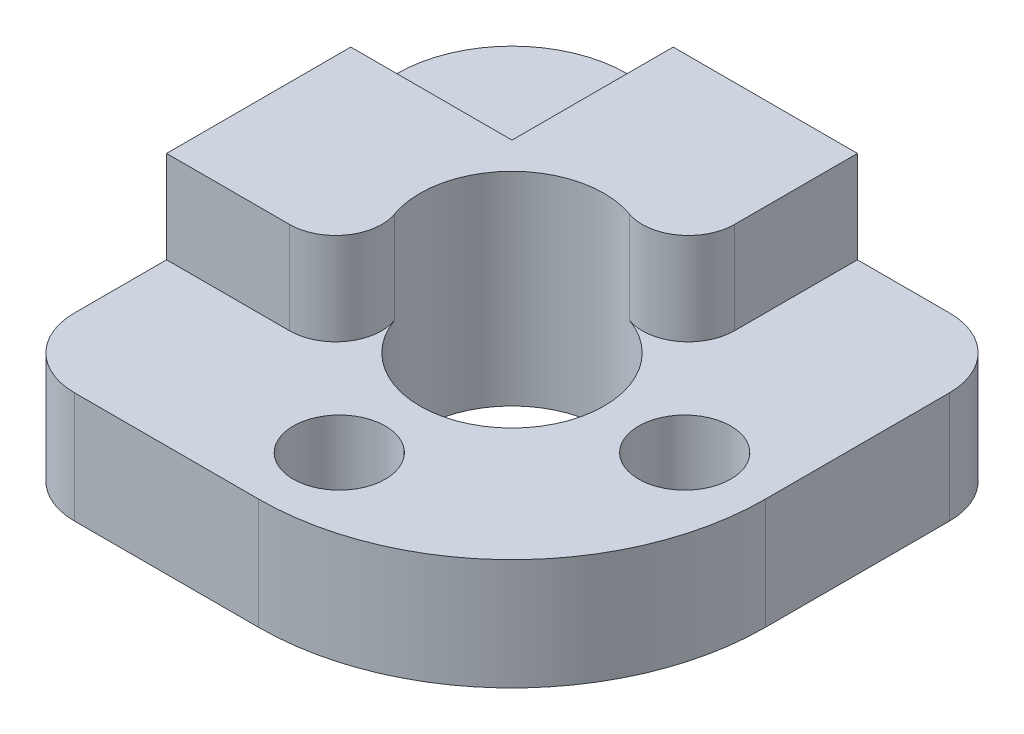
ISO-10303-21;
HEADER;
FILE_DESCRIPTION(('STEP AP214'),'2;1');
FILE_NAME('part.step','',(''),(''),'','','');
FILE_SCHEMA(('AUTOMOTIVE_DESIGN { 1 0 10303 214 1 1 1 1 }'));
ENDSEC;
DATA;
#1=APPLICATION_CONTEXT('core data for automotive mechanical design processes');
#2=APPLICATION_PROTOCOL_DEFINITION('international standard','automotive_design',2000,#1);
#3=PRODUCT_CONTEXT('',#1,'mechanical');
#4=PRODUCT('Part','Part','',(#3));
#5=PRODUCT_RELATED_PRODUCT_CATEGORY('part','',(#4));
#6=PRODUCT_DEFINITION_FORMATION('','',#4);
#7=PRODUCT_DEFINITION_CONTEXT('part definition',#1,'design');
#8=PRODUCT_DEFINITION('design','',#6,#7);
#9=PRODUCT_DEFINITION_SHAPE('','',#8);
#10=(LENGTH_UNIT() NAMED_UNIT(*) SI_UNIT(.MILLI.,.METRE.));
#11=(NAMED_UNIT(*) PLANE_ANGLE_UNIT() SI_UNIT($,.RADIAN.));
#12=(NAMED_UNIT(*) SI_UNIT($,.STERADIAN.) SOLID_ANGLE_UNIT());
#13=UNCERTAINTY_MEASURE_WITH_UNIT(LENGTH_MEASURE(1.E-05),#10,'distance_accuracy_value','');
#14=(GEOMETRIC_REPRESENTATION_CONTEXT(3) GLOBAL_UNCERTAINTY_ASSIGNED_CONTEXT((#13)) GLOBAL_UNIT_ASSIGNED_CONTEXT((#10,
#11,#12)) REPRESENTATION_CONTEXT('',''));
#15=CARTESIAN_POINT('',(0.,0.,0.));
#16=DIRECTION('',(0.,0.,1.));
#17=DIRECTION('',(1.,0.,0.));
#18=AXIS2_PLACEMENT_3D('',#15,#16,#17);
#19=CARTESIAN_POINT('',(635.26708984375,-230.9974182128,22.737565994263));
#20=DIRECTION('',(0.,-1.,0.));
#21=DIRECTION('',(1.,0.,0.));
#22=AXIS2_PLACEMENT_3D('',#19,#20,#21);
#23=CYLINDRICAL_SURFACE('',#22,2.);
#24=CARTESIAN_POINT('',(635.26708984376,-235.82241821281,22.737565994273));
#25=DIRECTION('',(0.,-1.,-5.00000234744697E-12));
#26=DIRECTION('',(1.,0.,0.));
#27=AXIS2_PLACEMENT_3D('',#24,#25,#26);
#28=CIRCLE('',#27,2.00000000001);
#29=CARTESIAN_POINT('',(637.26708984377,-235.82241821281,22.737565994273));
#30=VERTEX_POINT('',#29);
#31=EDGE_CURVE('E11',#30,#30,#28,.T.);
#32=ORIENTED_EDGE('',*,*,#31,.T.);
#33=EDGE_LOOP('',(#32));
#34=FACE_BOUND('',#33,.T.);
#35=CARTESIAN_POINT('',(635.26708984376,-230.99741821281,22.737565994273));
#36=DIRECTION('',(0.,-1.,-5.00000234744697E-12));
#37=DIRECTION('',(1.,0.,0.));
#38=AXIS2_PLACEMENT_3D('',#35,#36,#37);
#39=CIRCLE('',#38,2.00000000001);
#40=CARTESIAN_POINT('',(637.26708984377,-230.99741821281,22.737565994273));
#41=VERTEX_POINT('',#40);
#42=EDGE_CURVE('E271',#41,#41,#39,.T.);
#43=ORIENTED_EDGE('',*,*,#42,.F.);
#44=EDGE_LOOP('',(#43));
#45=FACE_BOUND('',#44,.T.);
#46=ADVANCED_FACE('F17',(#34,#45),#23,.F.);
#47=CARTESIAN_POINT('',(635.26708984375,-230.9974182128,15.237565994263));
#48=DIRECTION('',(0.,-1.,0.));
#49=DIRECTION('',(1.,0.,0.));
#50=AXIS2_PLACEMENT_3D('',#47,#48,#49);
#51=CYLINDRICAL_SURFACE('',#50,4.);
#52=CARTESIAN_POINT('',(635.26708984376,-235.82241821281,15.237565994273));
#53=DIRECTION('',(0.,-1.,-2.50000234746572E-12));
#54=DIRECTION('',(1.,0.,0.));
#55=AXIS2_PLACEMENT_3D('',#52,#53,#54);
#56=CIRCLE('',#55,4.00000000001001);
#57=CARTESIAN_POINT('',(639.26708984377,-235.82241821281,15.237565994273));
#58=VERTEX_POINT('',#57);
#59=EDGE_CURVE('E28',#58,#58,#56,.T.);
#60=ORIENTED_EDGE('',*,*,#59,.T.);
#61=EDGE_LOOP('',(#60));
#62=FACE_BOUND('',#61,.T.);
#63=CARTESIAN_POINT('',(635.26708984376,-226.99741821281,15.237565994273));
#64=DIRECTION('',(0.,-1.,-2.50000234746572E-12));
#65=DIRECTION('',(1.,0.,0.));
#66=AXIS2_PLACEMENT_3D('',#63,#64,#65);
#67=CIRCLE('',#66,4.00000000001001);
#68=CARTESIAN_POINT('',(631.495853677418,-226.9974182128,16.5708993275963));
#69=VERTEX_POINT('',#68);
#70=CARTESIAN_POINT('',(636.600423177082,-226.9974182128,11.4663298279341));
#71=VERTEX_POINT('',#70);
#72=EDGE_CURVE('E191',#69,#71,#67,.T.);
#73=ORIENTED_EDGE('',*,*,#72,.F.);
#74=DIRECTION('',(0.,1.,0.));
#75=VECTOR('',#74,1.);
#76=CARTESIAN_POINT('',(631.495853677432,-230.99741821281,16.5708993276055));
#77=LINE('',#76,#75);
#78=CARTESIAN_POINT('',(631.495853677418,-230.9974182128,16.5708993275963));
#79=VERTEX_POINT('',#78);
#80=EDGE_CURVE('E280',#79,#69,#77,.T.);
#81=ORIENTED_EDGE('',*,*,#80,.F.);
#82=CARTESIAN_POINT('',(635.26708984376,-230.99741821281,15.237565994273));
#83=DIRECTION('',(0.,-1.,-2.50000234746572E-12));
#84=DIRECTION('',(1.,0.,0.));
#85=AXIS2_PLACEMENT_3D('',#82,#83,#84);
#86=CIRCLE('',#85,4.00000000001001);
#87=CARTESIAN_POINT('',(636.600423177082,-230.9974182128,11.4663298279339));
#88=VERTEX_POINT('',#87);
#89=EDGE_CURVE('E21',#88,#79,#86,.T.);
#90=ORIENTED_EDGE('',*,*,#89,.F.);
#91=DIRECTION('',(0.,-1.,0.));
#92=VECTOR('',#91,1.);
#93=CARTESIAN_POINT('',(636.60042317709,-230.99741821281,11.4663298279436));
#94=LINE('',#93,#92);
#95=EDGE_CURVE('E43',#71,#88,#94,.T.);
#96=ORIENTED_EDGE('',*,*,#95,.F.);
#97=EDGE_LOOP('',(#73,#81,#90,#96));
#98=FACE_BOUND('',#97,.T.);
#99=ADVANCED_FACE('F1248',(#62,#98),#51,.F.);
#100=CARTESIAN_POINT('',(642.76708984375,-230.9974182128,15.237565994263));
#101=DIRECTION('',(0.,-1.,0.));
#102=DIRECTION('',(1.,0.,0.));
#103=AXIS2_PLACEMENT_3D('',#100,#101,#102);
#104=CYLINDRICAL_SURFACE('',#103,2.);
#105=CARTESIAN_POINT('',(642.76708984376,-235.82241821281,15.237565994273));
#106=DIRECTION('',(0.,-1.,-5.00000234744697E-12));
#107=DIRECTION('',(1.,0.,0.));
#108=AXIS2_PLACEMENT_3D('',#105,#106,#107);
#109=CIRCLE('',#108,2.00000000001);
#110=CARTESIAN_POINT('',(644.76708984377,-235.82241821281,15.237565994273));
#111=VERTEX_POINT('',#110);
#112=EDGE_CURVE('E229',#111,#111,#109,.T.);
#113=ORIENTED_EDGE('',*,*,#112,.T.);
#114=EDGE_LOOP('',(#113));
#115=FACE_BOUND('',#114,.T.);
#116=CARTESIAN_POINT('',(642.76708984376,-230.99741821281,15.237565994273));
#117=DIRECTION('',(0.,-1.,-5.00000234744697E-12));
#118=DIRECTION('',(1.,0.,0.));
#119=AXIS2_PLACEMENT_3D('',#116,#117,#118);
#120=CIRCLE('',#119,2.00000000001);
#121=CARTESIAN_POINT('',(644.76708984377,-230.99741821281,15.237565994273));
#122=VERTEX_POINT('',#121);
#123=EDGE_CURVE('E266',#122,#122,#120,.T.);
#124=ORIENTED_EDGE('',*,*,#123,.F.);
#125=EDGE_LOOP('',(#124));
#126=FACE_BOUND('',#125,.T.);
#127=ADVANCED_FACE('F1252',(#115,#126),#104,.F.);
#128=CARTESIAN_POINT('',(629.61023559425,-226.9974182128,17.237565994263));
#129=DIRECTION('',(0.,-1.,0.));
#130=DIRECTION('',(1.,0.,0.));
#131=AXIS2_PLACEMENT_3D('',#128,#129,#130);
#132=CYLINDRICAL_SURFACE('',#131,2.);
#133=CARTESIAN_POINT('',(629.61023559426,-226.99741821281,17.237565994273));
#134=DIRECTION('',(0.,-1.,-5.00000234744697E-12));
#135=DIRECTION('',(1.,0.,0.));
#136=AXIS2_PLACEMENT_3D('',#133,#134,#135);
#137=CIRCLE('',#136,2.00000000001);
#138=CARTESIAN_POINT('',(629.61023559425,-226.9974182128,19.237565994263));
#139=VERTEX_POINT('',#138);
#140=EDGE_CURVE('E206',#69,#139,#137,.T.);
#141=ORIENTED_EDGE('',*,*,#140,.T.);
#142=DIRECTION('',(0.,-1.,0.));
#143=VECTOR('',#142,1.);
#144=CARTESIAN_POINT('',(629.61023559426,-226.99741821281,19.237565994273));
#145=LINE('',#144,#143);
#146=CARTESIAN_POINT('',(629.61023559425,-230.9974182128,19.237565994263));
#147=VERTEX_POINT('',#146);
#148=EDGE_CURVE('E376',#139,#147,#145,.T.);
#149=ORIENTED_EDGE('',*,*,#148,.T.);
#150=CARTESIAN_POINT('',(629.61023559426,-230.99741821281,17.237565994273));
#151=DIRECTION('',(0.,-1.,-5.00000234744697E-12));
#152=DIRECTION('',(1.,0.,0.));
#153=AXIS2_PLACEMENT_3D('',#150,#151,#152);
#154=CIRCLE('',#153,2.00000000001);
#155=EDGE_CURVE('E317',#79,#147,#154,.T.);
#156=ORIENTED_EDGE('',*,*,#155,.F.);
#157=ORIENTED_EDGE('',*,*,#80,.T.);
#158=EDGE_LOOP('',(#141,#149,#156,#157));
#159=FACE_BOUND('',#158,.T.);
#160=ADVANCED_FACE('F1265',(#159),#132,.T.);
#161=CARTESIAN_POINT('',(635.26708984375,-235.8224182128,15.237565994263));
#162=DIRECTION('',(0.,1.,0.));
#163=DIRECTION('',(1.,0.,0.));
#164=AXIS2_PLACEMENT_3D('',#161,#162,#163);
#165=PLANE('',#164);
#166=DIRECTION('',(1.,0.,0.));
#167=VECTOR('',#166,1.);
#168=CARTESIAN_POINT('',(635.26708984376,-235.82241821281,26.237565994273));
#169=LINE('',#168,#167);
#170=CARTESIAN_POINT('',(627.26708984375,-235.8224182128,26.237565994263));
#171=VERTEX_POINT('',#170);
#172=CARTESIAN_POINT('',(635.26708984375,-235.8224182128,26.237565994263));
#173=VERTEX_POINT('',#172);
#174=EDGE_CURVE('E234',#171,#173,#169,.T.);
#175=ORIENTED_EDGE('',*,*,#174,.F.);
#176=CARTESIAN_POINT('',(627.26708984376,-235.82241821281,23.237565994273));
#177=DIRECTION('',(0.,1.,3.3333356807942E-12));
#178=DIRECTION('',(1.,0.,0.));
#179=AXIS2_PLACEMENT_3D('',#176,#177,#178);
#180=CIRCLE('',#179,3.00000000001);
#181=CARTESIAN_POINT('',(624.26708984375,-235.8224182128,23.237565994263));
#182=VERTEX_POINT('',#181);
#183=EDGE_CURVE('E257',#182,#171,#180,.T.);
#184=ORIENTED_EDGE('',*,*,#183,.F.);
#185=DIRECTION('',(0.,0.,1.));
#186=VECTOR('',#185,1.);
#187=CARTESIAN_POINT('',(624.26708984376,-235.82241821281,15.237565994273));
#188=LINE('',#187,#186);
#189=CARTESIAN_POINT('',(624.26708984375,-235.8224182128,9.237565994263));
#190=VERTEX_POINT('',#189);
#191=EDGE_CURVE('E258',#190,#182,#188,.T.);
#192=ORIENTED_EDGE('',*,*,#191,.F.);
#193=CARTESIAN_POINT('',(629.26708984376,-235.82241821281,9.237565994273));
#194=DIRECTION('',(0.,1.,2.00000234746798E-12));
#195=DIRECTION('',(1.,0.,0.));
#196=AXIS2_PLACEMENT_3D('',#193,#194,#195);
#197=CIRCLE('',#196,5.00000000001);
#198=CARTESIAN_POINT('',(629.267089843745,-235.8224182128,4.237565994263));
#199=VERTEX_POINT('',#198);
#200=EDGE_CURVE('E261',#199,#190,#197,.T.);
#201=ORIENTED_EDGE('',*,*,#200,.F.);
#202=DIRECTION('',(-1.,0.,0.));
#203=VECTOR('',#202,1.);
#204=CARTESIAN_POINT('',(635.26708984376,-235.82241821281,4.237565994273));
#205=LINE('',#204,#203);
#206=CARTESIAN_POINT('',(643.26708984375,-235.8224182128,4.237565994263));
#207=VERTEX_POINT('',#206);
#208=EDGE_CURVE('E279',#207,#199,#205,.T.);
#209=ORIENTED_EDGE('',*,*,#208,.F.);
#210=CARTESIAN_POINT('',(643.26708984376,-235.82241821281,7.237565994273));
#211=DIRECTION('',(0.,1.,3.3333356807942E-12));
#212=DIRECTION('',(1.,0.,0.));
#213=AXIS2_PLACEMENT_3D('',#210,#211,#212);
#214=CIRCLE('',#213,3.00000000001);
#215=CARTESIAN_POINT('',(646.26708984375,-235.8224182128,7.237565994263));
#216=VERTEX_POINT('',#215);
#217=EDGE_CURVE('E364',#216,#207,#214,.T.);
#218=ORIENTED_EDGE('',*,*,#217,.F.);
#219=DIRECTION('',(0.,0.,-1.));
#220=VECTOR('',#219,1.);
#221=CARTESIAN_POINT('',(646.26708984376,-235.82241821281,15.237565994273));
#222=LINE('',#221,#220);
#223=CARTESIAN_POINT('',(646.26708984375,-235.8224182128,15.237565994263));
#224=VERTEX_POINT('',#223);
#225=EDGE_CURVE('E304',#224,#216,#222,.T.);
#226=ORIENTED_EDGE('',*,*,#225,.F.);
#227=CARTESIAN_POINT('',(635.26708984376,-235.82241821281,15.237565994273));
#228=DIRECTION('',(-9.11614143236955E-13,1.,9.09093256562885E-13));
#229=DIRECTION('',(1.,9.11614143236955E-13,0.));
#230=AXIS2_PLACEMENT_3D('',#227,#228,#229);
#231=CIRCLE('',#230,11.00000000001);
#232=EDGE_CURVE('E233',#173,#224,#231,.T.);
#233=ORIENTED_EDGE('',*,*,#232,.F.);
#234=EDGE_LOOP('',(#175,#184,#192,#201,#209,#218,#226,#233));
#235=FACE_BOUND('',#234,.T.);
#236=ORIENTED_EDGE('',*,*,#31,.F.);
#237=EDGE_LOOP('',(#236));
#238=FACE_BOUND('',#237,.T.);
#239=ORIENTED_EDGE('',*,*,#59,.F.);
#240=EDGE_LOOP('',(#239));
#241=FACE_BOUND('',#240,.T.);
#242=ORIENTED_EDGE('',*,*,#112,.F.);
#243=EDGE_LOOP('',(#242));
#244=FACE_BOUND('',#243,.T.);
#245=ADVANCED_FACE('F417',(#235,#238,#241,#244),#165,.F.);
#246=CARTESIAN_POINT('',(635.26708984375,-230.9974182128,15.237565994263));
#247=DIRECTION('',(0.,-1.,0.));
#248=DIRECTION('',(1.,0.,0.));
#249=AXIS2_PLACEMENT_3D('',#246,#247,#248);
#250=CYLINDRICAL_SURFACE('',#249,11.);
#251=CARTESIAN_POINT('',(635.26708984376,-230.99741821281,15.237565994273));
#252=DIRECTION('',(9.11614143236955E-13,-1.,-9.09093256562885E-13));
#253=DIRECTION('',(1.,9.11614143236955E-13,0.));
#254=AXIS2_PLACEMENT_3D('',#251,#252,#253);
#255=CIRCLE('',#254,11.00000000001);
#256=CARTESIAN_POINT('',(646.26708984375,-230.9974182128,15.237565994263));
#257=VERTEX_POINT('',#256);
#258=CARTESIAN_POINT('',(635.26708984375,-230.9974182128,26.237565994263));
#259=VERTEX_POINT('',#258);
#260=EDGE_CURVE('E242',#257,#259,#255,.T.);
#261=ORIENTED_EDGE('',*,*,#260,.T.);
#262=DIRECTION('',(0.,-1.,0.));
#263=VECTOR('',#262,1.);
#264=CARTESIAN_POINT('',(635.26708984376,-230.99741821281,26.237565994273));
#265=LINE('',#264,#263);
#266=EDGE_CURVE('E238',#259,#173,#265,.T.);
#267=ORIENTED_EDGE('',*,*,#266,.T.);
#268=ORIENTED_EDGE('',*,*,#232,.T.);
#269=DIRECTION('',(0.,1.,0.));
#270=VECTOR('',#269,1.);
#271=CARTESIAN_POINT('',(646.26708984376,-230.99741821281,15.237565994273));
#272=LINE('',#271,#270);
#273=EDGE_CURVE('E230',#224,#257,#272,.T.);
#274=ORIENTED_EDGE('',*,*,#273,.T.);
#275=EDGE_LOOP('',(#261,#267,#268,#274));
#276=FACE_BOUND('',#275,.T.);
#277=ADVANCED_FACE('F1234',(#276),#250,.T.);
#278=CARTESIAN_POINT('',(635.26708984375,-230.9974182128,26.237565994263));
#279=DIRECTION('',(0.,0.,-1.));
#280=DIRECTION('',(-1.,0.,0.));
#281=AXIS2_PLACEMENT_3D('',#278,#279,#280);
#282=PLANE('',#281);
#283=ORIENTED_EDGE('',*,*,#266,.F.);
#284=DIRECTION('',(1.,0.,0.));
#285=VECTOR('',#284,1.);
#286=CARTESIAN_POINT('',(635.26708984376,-230.99741821281,26.237565994273));
#287=LINE('',#286,#285);
#288=CARTESIAN_POINT('',(627.26708984375,-230.9974182128,26.237565994263));
#289=VERTEX_POINT('',#288);
#290=EDGE_CURVE('E298',#289,#259,#287,.T.);
#291=ORIENTED_EDGE('',*,*,#290,.F.);
#292=DIRECTION('',(0.,1.,0.));
#293=VECTOR('',#292,1.);
#294=CARTESIAN_POINT('',(627.26708984376,-230.99741821281,26.237565994273));
#295=LINE('',#294,#293);
#296=EDGE_CURVE('E253',#171,#289,#295,.T.);
#297=ORIENTED_EDGE('',*,*,#296,.F.);
#298=ORIENTED_EDGE('',*,*,#174,.T.);
#299=EDGE_LOOP('',(#283,#291,#297,#298));
#300=FACE_BOUND('',#299,.T.);
#301=ADVANCED_FACE('F1183',(#300),#282,.F.);
#302=CARTESIAN_POINT('',(627.26708984375,-230.9974182128,23.237565994263));
#303=DIRECTION('',(0.,-1.,0.));
#304=DIRECTION('',(1.,0.,0.));
#305=AXIS2_PLACEMENT_3D('',#302,#303,#304);
#306=CYLINDRICAL_SURFACE('',#305,3.);
#307=CARTESIAN_POINT('',(627.26708984376,-230.99741821281,23.237565994273));
#308=DIRECTION('',(0.,-1.,-3.3333356807942E-12));
#309=DIRECTION('',(1.,0.,0.));
#310=AXIS2_PLACEMENT_3D('',#307,#308,#309);
#311=CIRCLE('',#310,3.00000000001);
#312=CARTESIAN_POINT('',(624.26708984375,-230.9974182128,23.237565994263));
#313=VERTEX_POINT('',#312);
#314=EDGE_CURVE('E243',#289,#313,#311,.T.);
#315=ORIENTED_EDGE('',*,*,#314,.T.);
#316=DIRECTION('',(0.,-1.,0.));
#317=VECTOR('',#316,1.);
#318=CARTESIAN_POINT('',(624.26708984376,-230.99741821281,23.237565994273));
#319=LINE('',#318,#317);
#320=EDGE_CURVE('E247',#313,#182,#319,.T.);
#321=ORIENTED_EDGE('',*,*,#320,.T.);
#322=ORIENTED_EDGE('',*,*,#183,.T.);
#323=ORIENTED_EDGE('',*,*,#296,.T.);
#324=EDGE_LOOP('',(#315,#321,#322,#323));
#325=FACE_BOUND('',#324,.T.);
#326=ADVANCED_FACE('F1175',(#325),#306,.T.);
#327=CARTESIAN_POINT('',(624.26708984375,-230.9974182128,9.237565994263));
#328=DIRECTION('',(1.,0.,0.));
#329=DIRECTION('',(0.,1.,0.));
#330=AXIS2_PLACEMENT_3D('',#327,#328,#329);
#331=PLANE('',#330);
#332=DIRECTION('',(0.,0.,1.));
#333=VECTOR('',#332,1.);
#334=CARTESIAN_POINT('',(624.26708984376,-230.99741821281,9.237565994273));
#335=LINE('',#334,#333);
#336=CARTESIAN_POINT('',(624.26708984375,-230.9974182128,19.237565994263));
#337=VERTEX_POINT('',#336);
#338=EDGE_CURVE('E293',#337,#313,#335,.T.);
#339=ORIENTED_EDGE('',*,*,#338,.F.);
#340=DIRECTION('',(0.,-1.,0.));
#341=VECTOR('',#340,1.);
#342=CARTESIAN_POINT('',(624.26708984376,-230.99741821281,19.237565994273));
#343=LINE('',#342,#341);
#344=CARTESIAN_POINT('',(624.26708984375,-226.9974182128,19.237565994263));
#345=VERTEX_POINT('',#344);
#346=EDGE_CURVE('E186',#345,#337,#343,.T.);
#347=ORIENTED_EDGE('',*,*,#346,.F.);
#348=DIRECTION('',(0.,0.,1.));
#349=VECTOR('',#348,1.);
#350=CARTESIAN_POINT('',(624.26708984376,-226.99741821281,9.237565994273));
#351=LINE('',#350,#349);
#352=CARTESIAN_POINT('',(624.26708984375,-226.9974182128,11.237565994263));
#353=VERTEX_POINT('',#352);
#354=EDGE_CURVE('E183',#353,#345,#351,.T.);
#355=ORIENTED_EDGE('',*,*,#354,.F.);
#356=DIRECTION('',(0.,1.,0.));
#357=VECTOR('',#356,1.);
#358=CARTESIAN_POINT('',(624.26708984376,-230.99741821281,11.237565994273));
#359=LINE('',#358,#357);
#360=CARTESIAN_POINT('',(624.26708984375,-228.9974182128,11.237565994263));
#361=VERTEX_POINT('',#360);
#362=EDGE_CURVE('E170',#361,#353,#359,.T.);
#363=ORIENTED_EDGE('',*,*,#362,.F.);
#364=DIRECTION('',(0.,0.,1.));
#365=VECTOR('',#364,1.);
#366=CARTESIAN_POINT('',(624.26708984376,-228.99741821281,9.237565994273));
#367=LINE('',#366,#365);
#368=CARTESIAN_POINT('',(624.267089843756,-228.9974182128,9.237565994256));
#369=VERTEX_POINT('',#368);
#370=EDGE_CURVE('E209',#369,#361,#367,.T.);
#371=ORIENTED_EDGE('',*,*,#370,.F.);
#372=DIRECTION('',(0.,1.,0.));
#373=VECTOR('',#372,1.);
#374=CARTESIAN_POINT('',(624.26708984376,-230.99741821281,9.237565994266));
#375=LINE('',#374,#373);
#376=CARTESIAN_POINT('',(624.26708984375,-230.9974182128,9.23756599426125));
#377=VERTEX_POINT('',#376);
#378=EDGE_CURVE('E327',#377,#369,#375,.T.);
#379=ORIENTED_EDGE('',*,*,#378,.F.);
#380=DIRECTION('',(0.,1.,0.));
#381=VECTOR('',#380,1.);
#382=CARTESIAN_POINT('',(624.26708984376,-230.99741821281,9.237565994273));
#383=LINE('',#382,#381);
#384=EDGE_CURVE('E265',#190,#377,#383,.T.);
#385=ORIENTED_EDGE('',*,*,#384,.F.);
#386=ORIENTED_EDGE('',*,*,#191,.T.);
#387=ORIENTED_EDGE('',*,*,#320,.F.);
#388=EDGE_LOOP('',(#339,#347,#355,#363,#371,#379,#385,#386,#387));
#389=FACE_BOUND('',#388,.T.);
#390=ADVANCED_FACE('F185',(#389),#331,.F.);
#391=CARTESIAN_POINT('',(629.26708984375,-230.9974182128,9.237565994263));
#392=DIRECTION('',(0.,-1.,0.));
#393=DIRECTION('',(1.,0.,0.));
#394=AXIS2_PLACEMENT_3D('',#391,#392,#393);
#395=CYLINDRICAL_SURFACE('',#394,5.);
#396=CARTESIAN_POINT('',(629.26708984376,-230.99741821281,9.237565994273));
#397=DIRECTION('',(0.,-1.,-2.00000234746798E-12));
#398=DIRECTION('',(1.,0.,0.));
#399=AXIS2_PLACEMENT_3D('',#396,#397,#398);
#400=CIRCLE('',#399,5.00000000001);
#401=CARTESIAN_POINT('',(629.267089843738,-230.9974182128,4.23756599426634));
#402=VERTEX_POINT('',#401);
#403=EDGE_CURVE('E292',#377,#402,#400,.T.);
#404=ORIENTED_EDGE('',*,*,#403,.T.);
#405=DIRECTION('',(0.,-1.,0.));
#406=VECTOR('',#405,1.);
#407=CARTESIAN_POINT('',(629.26708984375,-230.99741821281,4.237565994273));
#408=LINE('',#407,#406);
#409=EDGE_CURVE('E264',#402,#199,#408,.T.);
#410=ORIENTED_EDGE('',*,*,#409,.T.);
#411=ORIENTED_EDGE('',*,*,#200,.T.);
#412=ORIENTED_EDGE('',*,*,#384,.T.);
#413=EDGE_LOOP('',(#404,#410,#411,#412));
#414=FACE_BOUND('',#413,.T.);
#415=ADVANCED_FACE('F429',(#414),#395,.T.);
#416=CARTESIAN_POINT('',(629.26708984375,-230.9974182128,4.237565994263));
#417=DIRECTION('',(0.,0.,1.));
#418=DIRECTION('',(1.,0.,0.));
#419=AXIS2_PLACEMENT_3D('',#416,#417,#418);
#420=PLANE('',#419);
#421=ORIENTED_EDGE('',*,*,#409,.F.);
#422=DIRECTION('',(0.,-1.,0.));
#423=VECTOR('',#422,1.);
#424=CARTESIAN_POINT('',(629.26708984374,-230.99741821281,4.23756599428636));
#425=LINE('',#424,#423);
#426=CARTESIAN_POINT('',(629.26708984373,-228.9974182128,4.23756599427302));
#427=VERTEX_POINT('',#426);
#428=EDGE_CURVE('E331',#427,#402,#425,.T.);
#429=ORIENTED_EDGE('',*,*,#428,.F.);
#430=DIRECTION('',(-1.,0.,0.));
#431=VECTOR('',#430,1.);
#432=CARTESIAN_POINT('',(631.26708984376,-228.99741821281,4.237565994273));
#433=LINE('',#432,#431);
#434=CARTESIAN_POINT('',(631.26708984375,-228.9974182128,4.237565994263));
#435=VERTEX_POINT('',#434);
#436=EDGE_CURVE('E217',#435,#427,#433,.T.);
#437=ORIENTED_EDGE('',*,*,#436,.F.);
#438=DIRECTION('',(0.,-1.,0.));
#439=VECTOR('',#438,1.);
#440=CARTESIAN_POINT('',(631.26708984376,-230.99741821281,4.237565994273));
#441=LINE('',#440,#439);
#442=CARTESIAN_POINT('',(631.26708984375,-226.9974182128,4.237565994263));
#443=VERTEX_POINT('',#442);
#444=EDGE_CURVE('E274',#443,#435,#441,.T.);
#445=ORIENTED_EDGE('',*,*,#444,.F.);
#446=DIRECTION('',(-1.,0.,0.));
#447=VECTOR('',#446,1.);
#448=CARTESIAN_POINT('',(629.26708984376,-226.99741821281,4.237565994273));
#449=LINE('',#448,#447);
#450=CARTESIAN_POINT('',(639.26708984375,-226.9974182128,4.237565994263));
#451=VERTEX_POINT('',#450);
#452=EDGE_CURVE('E237',#451,#443,#449,.T.);
#453=ORIENTED_EDGE('',*,*,#452,.F.);
#454=DIRECTION('',(0.,1.,0.));
#455=VECTOR('',#454,1.);
#456=CARTESIAN_POINT('',(639.26708984376,-230.99741821281,4.237565994273));
#457=LINE('',#456,#455);
#458=CARTESIAN_POINT('',(639.26708984375,-230.9974182128,4.237565994263));
#459=VERTEX_POINT('',#458);
#460=EDGE_CURVE('E251',#459,#451,#457,.T.);
#461=ORIENTED_EDGE('',*,*,#460,.F.);
#462=DIRECTION('',(-1.,0.,0.));
#463=VECTOR('',#462,1.);
#464=CARTESIAN_POINT('',(629.26708984376,-230.99741821281,4.237565994273));
#465=LINE('',#464,#463);
#466=CARTESIAN_POINT('',(643.26708984375,-230.9974182128,4.237565994263));
#467=VERTEX_POINT('',#466);
#468=EDGE_CURVE('E308',#467,#459,#465,.T.);
#469=ORIENTED_EDGE('',*,*,#468,.F.);
#470=DIRECTION('',(0.,1.,0.));
#471=VECTOR('',#470,1.);
#472=CARTESIAN_POINT('',(643.26708984376,-230.99741821281,4.237565994273));
#473=LINE('',#472,#471);
#474=EDGE_CURVE('E307',#207,#467,#473,.T.);
#475=ORIENTED_EDGE('',*,*,#474,.F.);
#476=ORIENTED_EDGE('',*,*,#208,.T.);
#477=EDGE_LOOP('',(#421,#429,#437,#445,#453,#461,#469,#475,#476));
#478=FACE_BOUND('',#477,.T.);
#479=ADVANCED_FACE('F424',(#478),#420,.F.);
#480=CARTESIAN_POINT('',(643.26708984375,-230.9974182128,7.237565994263));
#481=DIRECTION('',(0.,-1.,0.));
#482=DIRECTION('',(1.,0.,0.));
#483=AXIS2_PLACEMENT_3D('',#480,#481,#482);
#484=CYLINDRICAL_SURFACE('',#483,3.);
#485=CARTESIAN_POINT('',(643.26708984376,-230.99741821281,7.237565994273));
#486=DIRECTION('',(0.,-1.,-3.3333356807942E-12));
#487=DIRECTION('',(1.,0.,0.));
#488=AXIS2_PLACEMENT_3D('',#485,#486,#487);
#489=CIRCLE('',#488,3.00000000001);
#490=CARTESIAN_POINT('',(646.26708984375,-230.9974182128,7.237565994263));
#491=VERTEX_POINT('',#490);
#492=EDGE_CURVE('E309',#467,#491,#489,.T.);
#493=ORIENTED_EDGE('',*,*,#492,.T.);
#494=DIRECTION('',(0.,-1.,0.));
#495=VECTOR('',#494,1.);
#496=CARTESIAN_POINT('',(646.26708984376,-230.99741821281,7.237565994273));
#497=LINE('',#496,#495);
#498=EDGE_CURVE('E313',#491,#216,#497,.T.);
#499=ORIENTED_EDGE('',*,*,#498,.T.);
#500=ORIENTED_EDGE('',*,*,#217,.T.);
#501=ORIENTED_EDGE('',*,*,#474,.T.);
#502=EDGE_LOOP('',(#493,#499,#500,#501));
#503=FACE_BOUND('',#502,.T.);
#504=ADVANCED_FACE('F400',(#503),#484,.T.);
#505=CARTESIAN_POINT('',(646.26708984375,-230.9974182128,15.237565994263));
#506=DIRECTION('',(-1.,0.,0.));
#507=DIRECTION('',(0.,1.,0.));
#508=AXIS2_PLACEMENT_3D('',#505,#506,#507);
#509=PLANE('',#508);
#510=ORIENTED_EDGE('',*,*,#498,.F.);
#511=DIRECTION('',(0.,0.,-1.));
#512=VECTOR('',#511,1.);
#513=CARTESIAN_POINT('',(646.26708984376,-230.99741821281,15.237565994273));
#514=LINE('',#513,#512);
#515=EDGE_CURVE('E270',#257,#491,#514,.T.);
#516=ORIENTED_EDGE('',*,*,#515,.F.);
#517=ORIENTED_EDGE('',*,*,#273,.F.);
#518=ORIENTED_EDGE('',*,*,#225,.T.);
#519=EDGE_LOOP('',(#510,#516,#517,#518));
#520=FACE_BOUND('',#519,.T.);
#521=ADVANCED_FACE('F413',(#520),#509,.F.);
#522=CARTESIAN_POINT('',(635.26708984375,-230.9974182128,15.237565994263));
#523=DIRECTION('',(0.,1.,0.));
#524=DIRECTION('',(1.,0.,0.));
#525=AXIS2_PLACEMENT_3D('',#522,#523,#524);
#526=PLANE('',#525);
#527=ORIENTED_EDGE('',*,*,#492,.F.);
#528=ORIENTED_EDGE('',*,*,#468,.T.);
#529=DIRECTION('',(0.,0.,1.));
#530=VECTOR('',#529,1.);
#531=CARTESIAN_POINT('',(639.26708984376,-230.99741821281,15.237565994273));
#532=LINE('',#531,#530);
#533=CARTESIAN_POINT('',(639.26708984375,-230.9974182128,9.58071174477));
#534=VERTEX_POINT('',#533);
#535=EDGE_CURVE('E324',#459,#534,#532,.T.);
#536=ORIENTED_EDGE('',*,*,#535,.T.);
#537=CARTESIAN_POINT('',(637.26708984376,-230.99741821281,9.58071174478));
#538=DIRECTION('',(0.,-1.,-5.00000234744697E-12));
#539=DIRECTION('',(1.,0.,0.));
#540=AXIS2_PLACEMENT_3D('',#537,#538,#539);
#541=CIRCLE('',#540,2.00000000001);
#542=EDGE_CURVE('E320',#534,#88,#541,.T.);
#543=ORIENTED_EDGE('',*,*,#542,.T.);
#544=ORIENTED_EDGE('',*,*,#89,.T.);
#545=ORIENTED_EDGE('',*,*,#155,.T.);
#546=DIRECTION('',(-1.,0.,0.));
#547=VECTOR('',#546,1.);
#548=CARTESIAN_POINT('',(635.26708984376,-230.99741821281,19.237565994273));
#549=LINE('',#548,#547);
#550=EDGE_CURVE('E297',#147,#337,#549,.T.);
#551=ORIENTED_EDGE('',*,*,#550,.T.);
#552=ORIENTED_EDGE('',*,*,#338,.T.);
#553=ORIENTED_EDGE('',*,*,#314,.F.);
#554=ORIENTED_EDGE('',*,*,#290,.T.);
#555=ORIENTED_EDGE('',*,*,#260,.F.);
#556=ORIENTED_EDGE('',*,*,#515,.T.);
#557=EDGE_LOOP('',(#527,#528,#536,#543,#544,#545,#551,#552,#553,#554,#555,#556));
#558=FACE_BOUND('',#557,.T.);
#559=ORIENTED_EDGE('',*,*,#123,.T.);
#560=EDGE_LOOP('',(#559));
#561=FACE_BOUND('',#560,.T.);
#562=ORIENTED_EDGE('',*,*,#42,.T.);
#563=EDGE_LOOP('',(#562));
#564=FACE_BOUND('',#563,.T.);
#565=ADVANCED_FACE('F406',(#558,#561,#564),#526,.T.);
#566=CARTESIAN_POINT('',(637.26708984375,-226.9974182128,9.58071174477));
#567=DIRECTION('',(0.,-1.,0.));
#568=DIRECTION('',(1.,0.,0.));
#569=AXIS2_PLACEMENT_3D('',#566,#567,#568);
#570=CYLINDRICAL_SURFACE('',#569,2.);
#571=ORIENTED_EDGE('',*,*,#95,.T.);
#572=ORIENTED_EDGE('',*,*,#542,.F.);
#573=DIRECTION('',(0.,1.,0.));
#574=VECTOR('',#573,1.);
#575=CARTESIAN_POINT('',(639.26708984376,-226.99741821281,9.58071174478));
#576=LINE('',#575,#574);
#577=CARTESIAN_POINT('',(639.26708984375,-226.9974182128,9.58071174477));
#578=VERTEX_POINT('',#577);
#579=EDGE_CURVE('E339',#534,#578,#576,.T.);
#580=ORIENTED_EDGE('',*,*,#579,.T.);
#581=CARTESIAN_POINT('',(637.26708984376,-226.99741821281,9.58071174478));
#582=DIRECTION('',(0.,-1.,-5.00000234744697E-12));
#583=DIRECTION('',(1.,0.,0.));
#584=AXIS2_PLACEMENT_3D('',#581,#582,#583);
#585=CIRCLE('',#584,2.00000000001);
#586=EDGE_CURVE('E190',#578,#71,#585,.T.);
#587=ORIENTED_EDGE('',*,*,#586,.T.);
#588=EDGE_LOOP('',(#571,#572,#580,#587));
#589=FACE_BOUND('',#588,.T.);
#590=ADVANCED_FACE('F1086',(#589),#570,.T.);
#591=CARTESIAN_POINT('',(629.61023559425,-226.9974182128,17.237565994263));
#592=DIRECTION('',(0.,-1.,0.));
#593=DIRECTION('',(0.,0.,-1.));
#594=AXIS2_PLACEMENT_3D('',#591,#592,#593);
#595=PLANE('',#594);
#596=DIRECTION('',(0.,0.,-1.));
#597=VECTOR('',#596,1.);
#598=CARTESIAN_POINT('',(631.26708984376,-226.99741821281,17.237565994273));
#599=LINE('',#598,#597);
#600=CARTESIAN_POINT('',(631.26708984375,-226.9974182128,11.237565994263));
#601=VERTEX_POINT('',#600);
#602=EDGE_CURVE('E196',#601,#443,#599,.T.);
#603=ORIENTED_EDGE('',*,*,#602,.F.);
#604=DIRECTION('',(1.,0.,0.));
#605=VECTOR('',#604,1.);
#606=CARTESIAN_POINT('',(629.61023559426,-226.99741821281,11.237565994273));
#607=LINE('',#606,#605);
#608=EDGE_CURVE('E175',#353,#601,#607,.T.);
#609=ORIENTED_EDGE('',*,*,#608,.F.);
#610=ORIENTED_EDGE('',*,*,#354,.T.);
#611=DIRECTION('',(-1.,0.,0.));
#612=VECTOR('',#611,1.);
#613=CARTESIAN_POINT('',(629.61023559426,-226.99741821281,19.237565994273));
#614=LINE('',#613,#612);
#615=EDGE_CURVE('E203',#139,#345,#614,.T.);
#616=ORIENTED_EDGE('',*,*,#615,.F.);
#617=ORIENTED_EDGE('',*,*,#140,.F.);
#618=ORIENTED_EDGE('',*,*,#72,.T.);
#619=ORIENTED_EDGE('',*,*,#586,.F.);
#620=DIRECTION('',(0.,0.,1.));
#621=VECTOR('',#620,1.);
#622=CARTESIAN_POINT('',(639.26708984376,-226.99741821281,17.237565994273));
#623=LINE('',#622,#621);
#624=EDGE_CURVE('E248',#451,#578,#623,.T.);
#625=ORIENTED_EDGE('',*,*,#624,.F.);
#626=ORIENTED_EDGE('',*,*,#452,.T.);
#627=EDGE_LOOP('',(#603,#609,#610,#616,#617,#618,#619,#625,#626));
#628=FACE_BOUND('',#627,.T.);
#629=ADVANCED_FACE('F193',(#628),#595,.F.);
#630=CARTESIAN_POINT('',(629.61023559425,-226.9974182128,19.237565994263));
#631=DIRECTION('',(0.,0.,-1.));
#632=DIRECTION('',(-1.,0.,0.));
#633=AXIS2_PLACEMENT_3D('',#630,#631,#632);
#634=PLANE('',#633);
#635=ORIENTED_EDGE('',*,*,#148,.F.);
#636=ORIENTED_EDGE('',*,*,#615,.T.);
#637=ORIENTED_EDGE('',*,*,#346,.T.);
#638=ORIENTED_EDGE('',*,*,#550,.F.);
#639=EDGE_LOOP('',(#635,#636,#637,#638));
#640=FACE_BOUND('',#639,.T.);
#641=ADVANCED_FACE('F469',(#640),#634,.F.);
#642=CARTESIAN_POINT('',(631.26708984375,-226.9974182128,11.237565994263));
#643=DIRECTION('',(0.,0.,1.));
#644=DIRECTION('',(1.,0.,0.));
#645=AXIS2_PLACEMENT_3D('',#642,#643,#644);
#646=PLANE('',#645);
#647=ORIENTED_EDGE('',*,*,#608,.T.);
#648=DIRECTION('',(0.,1.,0.));
#649=VECTOR('',#648,1.);
#650=CARTESIAN_POINT('',(631.26708984376,-226.99741821281,11.237565994273));
#651=LINE('',#650,#649);
#652=CARTESIAN_POINT('',(631.26708984375,-228.9974182128,11.237565994263));
#653=VERTEX_POINT('',#652);
#654=EDGE_CURVE('E272',#653,#601,#651,.T.);
#655=ORIENTED_EDGE('',*,*,#654,.F.);
#656=DIRECTION('',(1.,0.,0.));
#657=VECTOR('',#656,1.);
#658=CARTESIAN_POINT('',(631.26708984376,-228.99741821281,11.237565994273));
#659=LINE('',#658,#657);
#660=EDGE_CURVE('E178',#361,#653,#659,.T.);
#661=ORIENTED_EDGE('',*,*,#660,.F.);
#662=ORIENTED_EDGE('',*,*,#362,.T.);
#663=EDGE_LOOP('',(#647,#655,#661,#662));
#664=FACE_BOUND('',#663,.T.);
#665=ADVANCED_FACE('F172',(#664),#646,.F.);
#666=CARTESIAN_POINT('',(629.26710140427,-230.9974182128,9.237577554784));
#667=DIRECTION('',(0.,-1.,0.));
#668=DIRECTION('',(1.,0.,0.));
#669=AXIS2_PLACEMENT_3D('',#666,#667,#668);
#670=CYLINDRICAL_SURFACE('',#669,5.00001156052099);
#671=CARTESIAN_POINT('',(629.26710140428,-228.99741821281,9.237577554794));
#672=DIRECTION('',(0.,-1.,-2.00021742040322E-12));
#673=DIRECTION('',(1.,0.,0.));
#674=AXIS2_PLACEMENT_3D('',#671,#672,#673);
#675=CIRCLE('',#674,5.00001156053099);
#676=EDGE_CURVE('E180',#369,#427,#675,.T.);
#677=ORIENTED_EDGE('',*,*,#676,.T.);
#678=ORIENTED_EDGE('',*,*,#428,.T.);
#679=ORIENTED_EDGE('',*,*,#403,.F.);
#680=ORIENTED_EDGE('',*,*,#378,.T.);
#681=EDGE_LOOP('',(#677,#678,#679,#680));
#682=FACE_BOUND('',#681,.T.);
#683=ADVANCED_FACE('F19',(#682),#670,.T.);
#684=CARTESIAN_POINT('',(631.26708984375,-226.9974182128,4.237565994263));
#685=DIRECTION('',(1.,0.,0.));
#686=DIRECTION('',(0.,1.,0.));
#687=AXIS2_PLACEMENT_3D('',#684,#685,#686);
#688=PLANE('',#687);
#689=ORIENTED_EDGE('',*,*,#602,.T.);
#690=ORIENTED_EDGE('',*,*,#444,.T.);
#691=DIRECTION('',(0.,0.,-1.));
#692=VECTOR('',#691,1.);
#693=CARTESIAN_POINT('',(631.26708984376,-228.99741821281,4.237565994273));
#694=LINE('',#693,#692);
#695=EDGE_CURVE('E223',#653,#435,#694,.T.);
#696=ORIENTED_EDGE('',*,*,#695,.F.);
#697=ORIENTED_EDGE('',*,*,#654,.T.);
#698=EDGE_LOOP('',(#689,#690,#696,#697));
#699=FACE_BOUND('',#698,.T.);
#700=ADVANCED_FACE('F438',(#699),#688,.F.);
#701=CARTESIAN_POINT('',(639.26708984375,-226.9974182128,9.58071174477));
#702=DIRECTION('',(-1.,0.,0.));
#703=DIRECTION('',(0.,1.,0.));
#704=AXIS2_PLACEMENT_3D('',#701,#702,#703);
#705=PLANE('',#704);
#706=ORIENTED_EDGE('',*,*,#460,.T.);
#707=ORIENTED_EDGE('',*,*,#624,.T.);
#708=ORIENTED_EDGE('',*,*,#579,.F.);
#709=ORIENTED_EDGE('',*,*,#535,.F.);
#710=EDGE_LOOP('',(#706,#707,#708,#709));
#711=FACE_BOUND('',#710,.T.);
#712=ADVANCED_FACE('F1124',(#711),#705,.F.);
#713=CARTESIAN_POINT('',(624.26708984375,-228.9974182128,9.237565994263));
#714=DIRECTION('',(0.,-1.,0.));
#715=DIRECTION('',(0.,0.,-1.));
#716=AXIS2_PLACEMENT_3D('',#713,#714,#715);
#717=PLANE('',#716);
#718=ORIENTED_EDGE('',*,*,#695,.T.);
#719=ORIENTED_EDGE('',*,*,#436,.T.);
#720=ORIENTED_EDGE('',*,*,#676,.F.);
#721=ORIENTED_EDGE('',*,*,#370,.T.);
#722=ORIENTED_EDGE('',*,*,#660,.T.);
#723=EDGE_LOOP('',(#718,#719,#720,#721,#722));
#724=FACE_BOUND('',#723,.T.);
#725=ADVANCED_FACE('F433',(#724),#717,.F.);
#726=CLOSED_SHELL('',(#46,#99,#127,#160,#245,#277,#301,#326,#390,#415,#479,#504,#521,#565,#590,
#629,#641,#665,#683,#700,#712,#725));
#727=MANIFOLD_SOLID_BREP('B1',#726);
#728=ADVANCED_BREP_SHAPE_REPRESENTATION('',(#18,#727),#14);
#729=SHAPE_DEFINITION_REPRESENTATION(#9,#728);
ENDSEC;
END-ISO-10303-21;
